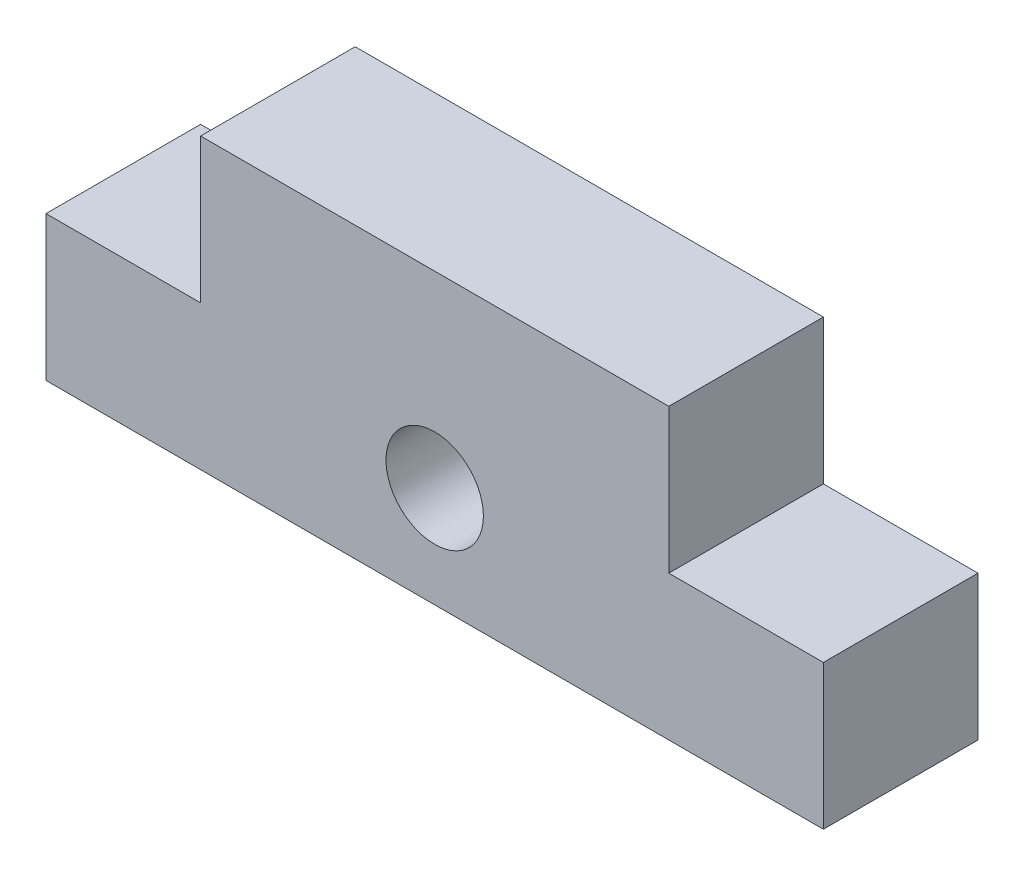
ISO-10303-21;
HEADER;
FILE_DESCRIPTION(('STEP AP214'),'2;1');
FILE_NAME('part.step','',(''),(''),'','','');
FILE_SCHEMA(('AUTOMOTIVE_DESIGN { 1 0 10303 214 1 1 1 1 }'));
ENDSEC;
DATA;
#1=APPLICATION_CONTEXT('core data for automotive mechanical design processes');
#2=APPLICATION_PROTOCOL_DEFINITION('international standard','automotive_design',2000,#1);
#3=PRODUCT_CONTEXT('',#1,'mechanical');
#4=PRODUCT('Part','Part','',(#3));
#5=PRODUCT_RELATED_PRODUCT_CATEGORY('part','',(#4));
#6=PRODUCT_DEFINITION_FORMATION('','',#4);
#7=PRODUCT_DEFINITION_CONTEXT('part definition',#1,'design');
#8=PRODUCT_DEFINITION('design','',#6,#7);
#9=PRODUCT_DEFINITION_SHAPE('','',#8);
#10=(LENGTH_UNIT() NAMED_UNIT(*) SI_UNIT(.MILLI.,.METRE.));
#11=(NAMED_UNIT(*) PLANE_ANGLE_UNIT() SI_UNIT($,.RADIAN.));
#12=(NAMED_UNIT(*) SI_UNIT($,.STERADIAN.) SOLID_ANGLE_UNIT());
#13=UNCERTAINTY_MEASURE_WITH_UNIT(LENGTH_MEASURE(1.E-05),#10,'distance_accuracy_value','');
#14=(GEOMETRIC_REPRESENTATION_CONTEXT(3) GLOBAL_UNCERTAINTY_ASSIGNED_CONTEXT((#13)) GLOBAL_UNIT_ASSIGNED_CONTEXT((#10,
#11,#12)) REPRESENTATION_CONTEXT('',''));
#15=CARTESIAN_POINT('',(0.,0.,0.));
#16=DIRECTION('',(0.,0.,1.));
#17=DIRECTION('',(1.,0.,0.));
#18=AXIS2_PLACEMENT_3D('',#15,#16,#17);
#19=CARTESIAN_POINT('',(0.,0.,5.35));
#20=DIRECTION('',(0.,0.,1.));
#21=DIRECTION('',(1.,0.,0.));
#22=AXIS2_PLACEMENT_3D('',#19,#20,#21);
#23=PLANE('',#22);
#24=DIRECTION('',(-1.,0.,0.));
#25=VECTOR('',#24,1.);
#26=CARTESIAN_POINT('',(21.5500006451998,9.9999997764007,5.35));
#27=LINE('',#26,#25);
#28=CARTESIAN_POINT('',(21.5500006451998,9.9999997764007,5.35));
#29=VERTEX_POINT('',#28);
#30=CARTESIAN_POINT('',(5.35000022500004,9.9999997764007,5.35));
#31=VERTEX_POINT('',#30);
#32=EDGE_CURVE('E145',#29,#31,#27,.T.);
#33=ORIENTED_EDGE('',*,*,#32,.T.);
#34=DIRECTION('',(0.,-1.,0.));
#35=VECTOR('',#34,1.);
#36=CARTESIAN_POINT('',(5.35000022500004,9.9999997764007,5.35));
#37=LINE('',#36,#35);
#38=CARTESIAN_POINT('',(5.35000022500004,4.9999998882006,5.35));
#39=VERTEX_POINT('',#38);
#40=EDGE_CURVE('E93',#31,#39,#37,.T.);
#41=ORIENTED_EDGE('',*,*,#40,.T.);
#42=DIRECTION('',(-1.,0.,0.));
#43=VECTOR('',#42,1.);
#44=CARTESIAN_POINT('',(5.35000022500004,4.9999998882006,5.35));
#45=LINE('',#44,#43);
#46=CARTESIAN_POINT('',(0.,4.9999998882006,5.35));
#47=VERTEX_POINT('',#46);
#48=EDGE_CURVE('E160',#39,#47,#45,.T.);
#49=ORIENTED_EDGE('',*,*,#48,.T.);
#50=DIRECTION('',(0.,-1.,0.));
#51=VECTOR('',#50,1.);
#52=CARTESIAN_POINT('',(0.,4.9999998882006,5.35));
#53=LINE('',#52,#51);
#54=CARTESIAN_POINT('',(0.,0.,5.35));
#55=VERTEX_POINT('',#54);
#56=EDGE_CURVE('E173',#47,#55,#53,.T.);
#57=ORIENTED_EDGE('',*,*,#56,.T.);
#58=DIRECTION('',(1.,0.,0.));
#59=VECTOR('',#58,1.);
#60=CARTESIAN_POINT('',(0.,0.,5.35));
#61=LINE('',#60,#59);
#62=CARTESIAN_POINT('',(26.9000008702002,0.,5.35));
#63=VERTEX_POINT('',#62);
#64=EDGE_CURVE('E112',#55,#63,#61,.T.);
#65=ORIENTED_EDGE('',*,*,#64,.T.);
#66=DIRECTION('',(0.,1.,0.));
#67=VECTOR('',#66,1.);
#68=CARTESIAN_POINT('',(26.9000008702002,0.,5.35));
#69=LINE('',#68,#67);
#70=CARTESIAN_POINT('',(26.9000008702002,4.99999988820046,5.35));
#71=VERTEX_POINT('',#70);
#72=EDGE_CURVE('E106',#63,#71,#69,.T.);
#73=ORIENTED_EDGE('',*,*,#72,.T.);
#74=DIRECTION('',(-1.,0.,0.));
#75=VECTOR('',#74,1.);
#76=CARTESIAN_POINT('',(26.9000008702002,4.99999988820046,5.35));
#77=LINE('',#76,#75);
#78=CARTESIAN_POINT('',(21.5500006451998,4.99999988820046,5.35));
#79=VERTEX_POINT('',#78);
#80=EDGE_CURVE('E110',#71,#79,#77,.T.);
#81=ORIENTED_EDGE('',*,*,#80,.T.);
#82=DIRECTION('',(0.,1.,0.));
#83=VECTOR('',#82,1.);
#84=CARTESIAN_POINT('',(21.5500006451998,4.99999988820046,5.35));
#85=LINE('',#84,#83);
#86=EDGE_CURVE('E50',#79,#29,#85,.T.);
#87=ORIENTED_EDGE('',*,*,#86,.T.);
#88=EDGE_LOOP('',(#33,#41,#49,#57,#65,#73,#81,#87));
#89=FACE_BOUND('',#88,.T.);
#90=CARTESIAN_POINT('',(13.4500004351,3.49999994410036,5.35));
#91=DIRECTION('',(0.,0.,1.));
#92=DIRECTION('',(1.,0.,0.));
#93=AXIS2_PLACEMENT_3D('',#90,#91,#92);
#94=CIRCLE('',#93,1.68499999999991);
#95=CARTESIAN_POINT('',(15.1350004350999,3.49999994410036,5.35));
#96=VERTEX_POINT('',#95);
#97=EDGE_CURVE('E134',#96,#96,#94,.T.);
#98=ORIENTED_EDGE('',*,*,#97,.F.);
#99=EDGE_LOOP('',(#98));
#100=FACE_BOUND('',#99,.T.);
#101=ADVANCED_FACE('F33',(#89,#100),#23,.T.);
#102=CARTESIAN_POINT('',(0.,0.,0.));
#103=DIRECTION('',(0.,0.,1.));
#104=DIRECTION('',(1.,0.,0.));
#105=AXIS2_PLACEMENT_3D('',#102,#103,#104);
#106=PLANE('',#105);
#107=DIRECTION('',(-1.,0.,0.));
#108=VECTOR('',#107,1.);
#109=CARTESIAN_POINT('',(21.5500006451998,9.9999997764007,0.));
#110=LINE('',#109,#108);
#111=CARTESIAN_POINT('',(21.5500006451998,9.9999997764007,0.));
#112=VERTEX_POINT('',#111);
#113=CARTESIAN_POINT('',(5.35000022500004,9.9999997764007,0.));
#114=VERTEX_POINT('',#113);
#115=EDGE_CURVE('E130',#112,#114,#110,.T.);
#116=ORIENTED_EDGE('',*,*,#115,.F.);
#117=DIRECTION('',(0.,1.,0.));
#118=VECTOR('',#117,1.);
#119=CARTESIAN_POINT('',(21.5500006451998,4.99999988820046,0.));
#120=LINE('',#119,#118);
#121=CARTESIAN_POINT('',(21.5500006451998,4.99999988820046,0.));
#122=VERTEX_POINT('',#121);
#123=EDGE_CURVE('E85',#122,#112,#120,.T.);
#124=ORIENTED_EDGE('',*,*,#123,.F.);
#125=DIRECTION('',(-1.,0.,0.));
#126=VECTOR('',#125,1.);
#127=CARTESIAN_POINT('',(26.9000008702002,4.99999988820046,0.));
#128=LINE('',#127,#126);
#129=CARTESIAN_POINT('',(26.9000008702002,4.99999988820046,0.));
#130=VERTEX_POINT('',#129);
#131=EDGE_CURVE('E79',#130,#122,#128,.T.);
#132=ORIENTED_EDGE('',*,*,#131,.F.);
#133=DIRECTION('',(0.,1.,0.));
#134=VECTOR('',#133,1.);
#135=CARTESIAN_POINT('',(26.9000008702002,0.,0.));
#136=LINE('',#135,#134);
#137=CARTESIAN_POINT('',(26.9000008702002,0.,0.));
#138=VERTEX_POINT('',#137);
#139=EDGE_CURVE('E120',#138,#130,#136,.T.);
#140=ORIENTED_EDGE('',*,*,#139,.F.);
#141=DIRECTION('',(1.,0.,0.));
#142=VECTOR('',#141,1.);
#143=CARTESIAN_POINT('',(0.,0.,0.));
#144=LINE('',#143,#142);
#145=CARTESIAN_POINT('',(0.,0.,0.));
#146=VERTEX_POINT('',#145);
#147=EDGE_CURVE('E140',#146,#138,#144,.T.);
#148=ORIENTED_EDGE('',*,*,#147,.F.);
#149=DIRECTION('',(0.,-1.,0.));
#150=VECTOR('',#149,1.);
#151=CARTESIAN_POINT('',(0.,4.9999998882006,0.));
#152=LINE('',#151,#150);
#153=CARTESIAN_POINT('',(0.,4.9999998882006,0.));
#154=VERTEX_POINT('',#153);
#155=EDGE_CURVE('E138',#154,#146,#152,.T.);
#156=ORIENTED_EDGE('',*,*,#155,.F.);
#157=DIRECTION('',(-1.,0.,0.));
#158=VECTOR('',#157,1.);
#159=CARTESIAN_POINT('',(5.35000022500004,4.9999998882006,0.));
#160=LINE('',#159,#158);
#161=CARTESIAN_POINT('',(5.35000022500004,4.9999998882006,0.));
#162=VERTEX_POINT('',#161);
#163=EDGE_CURVE('E136',#162,#154,#160,.T.);
#164=ORIENTED_EDGE('',*,*,#163,.F.);
#165=DIRECTION('',(0.,-1.,0.));
#166=VECTOR('',#165,1.);
#167=CARTESIAN_POINT('',(5.35000022500004,9.9999997764007,0.));
#168=LINE('',#167,#166);
#169=EDGE_CURVE('E133',#114,#162,#168,.T.);
#170=ORIENTED_EDGE('',*,*,#169,.F.);
#171=EDGE_LOOP('',(#116,#124,#132,#140,#148,#156,#164,#170));
#172=FACE_BOUND('',#171,.T.);
#173=CARTESIAN_POINT('',(13.4500004351,3.49999994410036,0.));
#174=DIRECTION('',(0.,0.,1.));
#175=DIRECTION('',(1.,0.,0.));
#176=AXIS2_PLACEMENT_3D('',#173,#174,#175);
#177=CIRCLE('',#176,1.68499999999991);
#178=CARTESIAN_POINT('',(15.1350004350999,3.49999994410036,0.));
#179=VERTEX_POINT('',#178);
#180=EDGE_CURVE('E179',#179,#179,#177,.T.);
#181=ORIENTED_EDGE('',*,*,#180,.T.);
#182=EDGE_LOOP('',(#181));
#183=FACE_BOUND('',#182,.T.);
#184=ADVANCED_FACE('F164',(#172,#183),#106,.F.);
#185=CARTESIAN_POINT('',(21.5500006451998,9.9999997764007,5.35));
#186=DIRECTION('',(0.,-1.,0.));
#187=DIRECTION('',(0.,0.,-1.));
#188=AXIS2_PLACEMENT_3D('',#185,#186,#187);
#189=PLANE('',#188);
#190=ORIENTED_EDGE('',*,*,#115,.T.);
#191=DIRECTION('',(0.,0.,-1.));
#192=VECTOR('',#191,1.);
#193=CARTESIAN_POINT('',(5.35000022500004,9.9999997764007,5.35));
#194=LINE('',#193,#192);
#195=EDGE_CURVE('E11',#31,#114,#194,.T.);
#196=ORIENTED_EDGE('',*,*,#195,.F.);
#197=ORIENTED_EDGE('',*,*,#32,.F.);
#198=DIRECTION('',(0.,0.,-1.));
#199=VECTOR('',#198,1.);
#200=CARTESIAN_POINT('',(21.5500006451998,9.9999997764007,5.35));
#201=LINE('',#200,#199);
#202=EDGE_CURVE('E126',#29,#112,#201,.T.);
#203=ORIENTED_EDGE('',*,*,#202,.T.);
#204=EDGE_LOOP('',(#190,#196,#197,#203));
#205=FACE_BOUND('',#204,.T.);
#206=ADVANCED_FACE('F35',(#205),#189,.F.);
#207=CARTESIAN_POINT('',(5.35000022500004,9.9999997764007,5.35));
#208=DIRECTION('',(1.,0.,0.));
#209=DIRECTION('',(0.,0.,-1.));
#210=AXIS2_PLACEMENT_3D('',#207,#208,#209);
#211=PLANE('',#210);
#212=ORIENTED_EDGE('',*,*,#169,.T.);
#213=DIRECTION('',(0.,0.,-1.));
#214=VECTOR('',#213,1.);
#215=CARTESIAN_POINT('',(5.35000022500004,4.9999998882006,5.35));
#216=LINE('',#215,#214);
#217=EDGE_CURVE('E42',#39,#162,#216,.T.);
#218=ORIENTED_EDGE('',*,*,#217,.F.);
#219=ORIENTED_EDGE('',*,*,#40,.F.);
#220=ORIENTED_EDGE('',*,*,#195,.T.);
#221=EDGE_LOOP('',(#212,#218,#219,#220));
#222=FACE_BOUND('',#221,.T.);
#223=ADVANCED_FACE('F207',(#222),#211,.F.);
#224=CARTESIAN_POINT('',(5.35000022500004,4.9999998882006,5.35));
#225=DIRECTION('',(0.,-1.,0.));
#226=DIRECTION('',(0.,0.,-1.));
#227=AXIS2_PLACEMENT_3D('',#224,#225,#226);
#228=PLANE('',#227);
#229=ORIENTED_EDGE('',*,*,#163,.T.);
#230=DIRECTION('',(0.,0.,-1.));
#231=VECTOR('',#230,1.);
#232=CARTESIAN_POINT('',(0.,4.9999998882006,5.35));
#233=LINE('',#232,#231);
#234=EDGE_CURVE('E152',#47,#154,#233,.T.);
#235=ORIENTED_EDGE('',*,*,#234,.F.);
#236=ORIENTED_EDGE('',*,*,#48,.F.);
#237=ORIENTED_EDGE('',*,*,#217,.T.);
#238=EDGE_LOOP('',(#229,#235,#236,#237));
#239=FACE_BOUND('',#238,.T.);
#240=ADVANCED_FACE('F158',(#239),#228,.F.);
#241=CARTESIAN_POINT('',(0.,4.9999998882006,5.35));
#242=DIRECTION('',(1.,0.,0.));
#243=DIRECTION('',(0.,0.,-1.));
#244=AXIS2_PLACEMENT_3D('',#241,#242,#243);
#245=PLANE('',#244);
#246=ORIENTED_EDGE('',*,*,#155,.T.);
#247=DIRECTION('',(0.,0.,-1.));
#248=VECTOR('',#247,1.);
#249=CARTESIAN_POINT('',(0.,0.,5.35));
#250=LINE('',#249,#248);
#251=EDGE_CURVE('E149',#55,#146,#250,.T.);
#252=ORIENTED_EDGE('',*,*,#251,.F.);
#253=ORIENTED_EDGE('',*,*,#56,.F.);
#254=ORIENTED_EDGE('',*,*,#234,.T.);
#255=EDGE_LOOP('',(#246,#252,#253,#254));
#256=FACE_BOUND('',#255,.T.);
#257=ADVANCED_FACE('F169',(#256),#245,.F.);
#258=CARTESIAN_POINT('',(0.,0.,5.35));
#259=DIRECTION('',(0.,1.,0.));
#260=DIRECTION('',(0.,0.,1.));
#261=AXIS2_PLACEMENT_3D('',#258,#259,#260);
#262=PLANE('',#261);
#263=ORIENTED_EDGE('',*,*,#147,.T.);
#264=DIRECTION('',(0.,0.,-1.));
#265=VECTOR('',#264,1.);
#266=CARTESIAN_POINT('',(26.9000008702002,0.,5.35));
#267=LINE('',#266,#265);
#268=EDGE_CURVE('E121',#63,#138,#267,.T.);
#269=ORIENTED_EDGE('',*,*,#268,.F.);
#270=ORIENTED_EDGE('',*,*,#64,.F.);
#271=ORIENTED_EDGE('',*,*,#251,.T.);
#272=EDGE_LOOP('',(#263,#269,#270,#271));
#273=FACE_BOUND('',#272,.T.);
#274=ADVANCED_FACE('F172',(#273),#262,.F.);
#275=CARTESIAN_POINT('',(26.9000008702002,0.,5.35));
#276=DIRECTION('',(-1.,0.,0.));
#277=DIRECTION('',(0.,0.,1.));
#278=AXIS2_PLACEMENT_3D('',#275,#276,#277);
#279=PLANE('',#278);
#280=ORIENTED_EDGE('',*,*,#139,.T.);
#281=DIRECTION('',(0.,0.,-1.));
#282=VECTOR('',#281,1.);
#283=CARTESIAN_POINT('',(26.9000008702002,4.99999988820046,5.35));
#284=LINE('',#283,#282);
#285=EDGE_CURVE('E117',#71,#130,#284,.T.);
#286=ORIENTED_EDGE('',*,*,#285,.F.);
#287=ORIENTED_EDGE('',*,*,#72,.F.);
#288=ORIENTED_EDGE('',*,*,#268,.T.);
#289=EDGE_LOOP('',(#280,#286,#287,#288));
#290=FACE_BOUND('',#289,.T.);
#291=ADVANCED_FACE('F118',(#290),#279,.F.);
#292=CARTESIAN_POINT('',(26.9000008702002,4.99999988820046,5.35));
#293=DIRECTION('',(0.,-1.,0.));
#294=DIRECTION('',(0.,0.,-1.));
#295=AXIS2_PLACEMENT_3D('',#292,#293,#294);
#296=PLANE('',#295);
#297=ORIENTED_EDGE('',*,*,#131,.T.);
#298=DIRECTION('',(0.,0.,-1.));
#299=VECTOR('',#298,1.);
#300=CARTESIAN_POINT('',(21.5500006451998,4.99999988820046,5.35));
#301=LINE('',#300,#299);
#302=EDGE_CURVE('E122',#79,#122,#301,.T.);
#303=ORIENTED_EDGE('',*,*,#302,.F.);
#304=ORIENTED_EDGE('',*,*,#80,.F.);
#305=ORIENTED_EDGE('',*,*,#285,.T.);
#306=EDGE_LOOP('',(#297,#303,#304,#305));
#307=FACE_BOUND('',#306,.T.);
#308=ADVANCED_FACE('F124',(#307),#296,.F.);
#309=CARTESIAN_POINT('',(21.5500006451998,4.99999988820046,5.35));
#310=DIRECTION('',(-1.,0.,0.));
#311=DIRECTION('',(0.,0.,1.));
#312=AXIS2_PLACEMENT_3D('',#309,#310,#311);
#313=PLANE('',#312);
#314=ORIENTED_EDGE('',*,*,#123,.T.);
#315=ORIENTED_EDGE('',*,*,#202,.F.);
#316=ORIENTED_EDGE('',*,*,#86,.F.);
#317=ORIENTED_EDGE('',*,*,#302,.T.);
#318=EDGE_LOOP('',(#314,#315,#316,#317));
#319=FACE_BOUND('',#318,.T.);
#320=ADVANCED_FACE('F195',(#319),#313,.F.);
#321=CARTESIAN_POINT('',(13.4500004351,3.49999994410036,5.35));
#322=DIRECTION('',(0.,0.,-1.));
#323=DIRECTION('',(-1.,0.,0.));
#324=AXIS2_PLACEMENT_3D('',#321,#322,#323);
#325=CYLINDRICAL_SURFACE('',#324,1.68499999999991);
#326=ORIENTED_EDGE('',*,*,#97,.T.);
#327=EDGE_LOOP('',(#326));
#328=FACE_BOUND('',#327,.T.);
#329=ORIENTED_EDGE('',*,*,#180,.F.);
#330=EDGE_LOOP('',(#329));
#331=FACE_BOUND('',#330,.T.);
#332=ADVANCED_FACE('F185',(#328,#331),#325,.F.);
#333=CLOSED_SHELL('',(#101,#184,#206,#223,#240,#257,#274,#291,#308,#320,#332));
#334=MANIFOLD_SOLID_BREP('B2',#333);
#335=ADVANCED_BREP_SHAPE_REPRESENTATION('',(#18,#334),#14);
#336=SHAPE_DEFINITION_REPRESENTATION(#9,#335);
ENDSEC;
END-ISO-10303-21;
